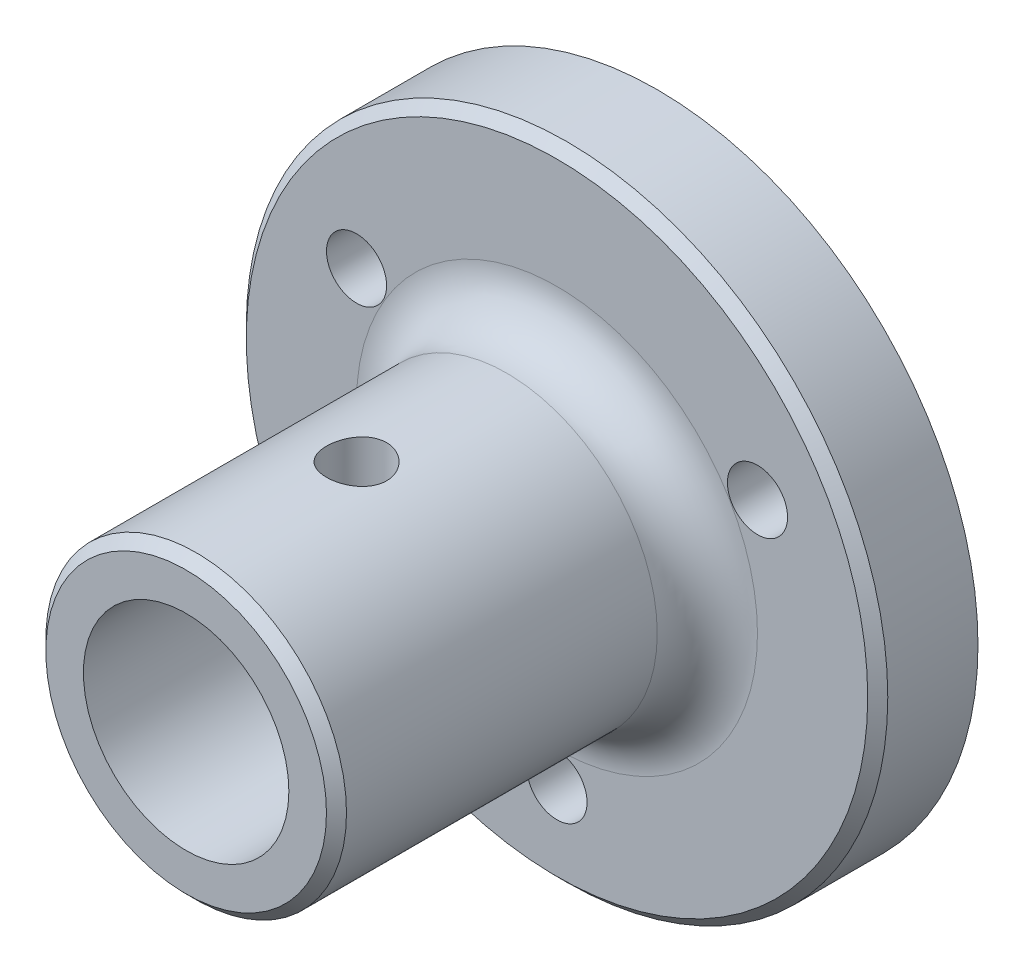
ISO-10303-21;
HEADER;
FILE_DESCRIPTION(('STEP AP214'),'2;1');
FILE_NAME('part.step','',(''),(''),'','','');
FILE_SCHEMA(('AUTOMOTIVE_DESIGN { 1 0 10303 214 1 1 1 1 }'));
ENDSEC;
DATA;
#1=APPLICATION_CONTEXT('core data for automotive mechanical design processes');
#2=APPLICATION_PROTOCOL_DEFINITION('international standard','automotive_design',2000,#1);
#3=PRODUCT_CONTEXT('',#1,'mechanical');
#4=PRODUCT('Part','Part','',(#3));
#5=PRODUCT_RELATED_PRODUCT_CATEGORY('part','',(#4));
#6=PRODUCT_DEFINITION_FORMATION('','',#4);
#7=PRODUCT_DEFINITION_CONTEXT('part definition',#1,'design');
#8=PRODUCT_DEFINITION('design','',#6,#7);
#9=PRODUCT_DEFINITION_SHAPE('','',#8);
#10=(LENGTH_UNIT() NAMED_UNIT(*) SI_UNIT(.MILLI.,.METRE.));
#11=(NAMED_UNIT(*) PLANE_ANGLE_UNIT() SI_UNIT($,.RADIAN.));
#12=(NAMED_UNIT(*) SI_UNIT($,.STERADIAN.) SOLID_ANGLE_UNIT());
#13=UNCERTAINTY_MEASURE_WITH_UNIT(LENGTH_MEASURE(1.E-05),#10,'distance_accuracy_value','');
#14=(GEOMETRIC_REPRESENTATION_CONTEXT(3) GLOBAL_UNCERTAINTY_ASSIGNED_CONTEXT((#13)) GLOBAL_UNIT_ASSIGNED_CONTEXT((#10,
#11,#12)) REPRESENTATION_CONTEXT('',''));
#15=CARTESIAN_POINT('',(0.,0.,0.));
#16=DIRECTION('',(0.,0.,1.));
#17=DIRECTION('',(1.,0.,0.));
#18=AXIS2_PLACEMENT_3D('',#15,#16,#17);
#19=CARTESIAN_POINT('',(0.,0.,10.));
#20=DIRECTION('',(0.,0.,1.));
#21=DIRECTION('',(1.,0.,0.));
#22=AXIS2_PLACEMENT_3D('',#19,#20,#21);
#23=PLANE('',#22);
#24=CARTESIAN_POINT('',(0.,0.,10.));
#25=DIRECTION('',(0.,0.,1.));
#26=DIRECTION('',(1.,0.,0.));
#27=AXIS2_PLACEMENT_3D('',#24,#25,#26);
#28=CIRCLE('',#27,31.);
#29=CARTESIAN_POINT('',(31.,0.,10.));
#30=VERTEX_POINT('',#29);
#31=EDGE_CURVE('E48',#30,#30,#28,.T.);
#32=ORIENTED_EDGE('',*,*,#31,.T.);
#33=EDGE_LOOP('',(#32));
#34=FACE_BOUND('',#33,.T.);
#35=CARTESIAN_POINT('',(0.,0.,10.));
#36=DIRECTION('',(0.,0.,1.));
#37=DIRECTION('',(1.,0.,0.));
#38=AXIS2_PLACEMENT_3D('',#35,#36,#37);
#39=CIRCLE('',#38,20.);
#40=CARTESIAN_POINT('',(20.,0.,10.));
#41=VERTEX_POINT('',#40);
#42=EDGE_CURVE('E64',#41,#41,#39,.F.);
#43=ORIENTED_EDGE('',*,*,#42,.T.);
#44=EDGE_LOOP('',(#43));
#45=FACE_BOUND('',#44,.T.);
#46=CARTESIAN_POINT('',(0.,-23.094010767585,10.));
#47=DIRECTION('',(0.,0.,1.));
#48=DIRECTION('',(1.,0.,0.));
#49=AXIS2_PLACEMENT_3D('',#46,#47,#48);
#50=CIRCLE('',#49,3.);
#51=CARTESIAN_POINT('',(3.,-23.094010767585,10.));
#52=VERTEX_POINT('',#51);
#53=EDGE_CURVE('E177',#52,#52,#50,.T.);
#54=ORIENTED_EDGE('',*,*,#53,.F.);
#55=EDGE_LOOP('',(#54));
#56=FACE_BOUND('',#55,.T.);
#57=CARTESIAN_POINT('',(20.,11.5470053837925,10.));
#58=DIRECTION('',(0.,0.,1.));
#59=DIRECTION('',(1.,0.,0.));
#60=AXIS2_PLACEMENT_3D('',#57,#58,#59);
#61=CIRCLE('',#60,3.);
#62=CARTESIAN_POINT('',(23.,11.5470053837925,10.));
#63=VERTEX_POINT('',#62);
#64=EDGE_CURVE('E185',#63,#63,#61,.T.);
#65=ORIENTED_EDGE('',*,*,#64,.F.);
#66=EDGE_LOOP('',(#65));
#67=FACE_BOUND('',#66,.T.);
#68=CARTESIAN_POINT('',(-20.,11.5470053837925,10.));
#69=DIRECTION('',(0.,0.,1.));
#70=DIRECTION('',(1.,0.,0.));
#71=AXIS2_PLACEMENT_3D('',#68,#69,#70);
#72=CIRCLE('',#71,3.);
#73=CARTESIAN_POINT('',(-17.,11.5470053837925,10.));
#74=VERTEX_POINT('',#73);
#75=EDGE_CURVE('E169',#74,#74,#72,.T.);
#76=ORIENTED_EDGE('',*,*,#75,.F.);
#77=EDGE_LOOP('',(#76));
#78=FACE_BOUND('',#77,.T.);
#79=ADVANCED_FACE('F39',(#34,#45,#56,#67,#78),#23,.T.);
#80=CARTESIAN_POINT('',(0.,0.,0.));
#81=DIRECTION('',(0.,0.,1.));
#82=DIRECTION('',(1.,0.,0.));
#83=AXIS2_PLACEMENT_3D('',#80,#81,#82);
#84=PLANE('',#83);
#85=CARTESIAN_POINT('',(0.,0.,0.));
#86=DIRECTION('',(0.,0.,1.));
#87=DIRECTION('',(1.,0.,0.));
#88=AXIS2_PLACEMENT_3D('',#85,#86,#87);
#89=CIRCLE('',#88,32.);
#90=CARTESIAN_POINT('',(32.,0.,0.));
#91=VERTEX_POINT('',#90);
#92=EDGE_CURVE('E189',#91,#91,#89,.T.);
#93=ORIENTED_EDGE('',*,*,#92,.F.);
#94=EDGE_LOOP('',(#93));
#95=FACE_BOUND('',#94,.T.);
#96=CARTESIAN_POINT('',(20.,11.5470053837925,0.));
#97=DIRECTION('',(0.,0.,1.));
#98=DIRECTION('',(1.,0.,0.));
#99=AXIS2_PLACEMENT_3D('',#96,#97,#98);
#100=CIRCLE('',#99,3.);
#101=CARTESIAN_POINT('',(23.,11.5470053837925,0.));
#102=VERTEX_POINT('',#101);
#103=EDGE_CURVE('E181',#102,#102,#100,.T.);
#104=ORIENTED_EDGE('',*,*,#103,.T.);
#105=EDGE_LOOP('',(#104));
#106=FACE_BOUND('',#105,.T.);
#107=CARTESIAN_POINT('',(0.,-23.094010767585,0.));
#108=DIRECTION('',(0.,0.,1.));
#109=DIRECTION('',(1.,0.,0.));
#110=AXIS2_PLACEMENT_3D('',#107,#108,#109);
#111=CIRCLE('',#110,3.);
#112=CARTESIAN_POINT('',(3.,-23.094010767585,0.));
#113=VERTEX_POINT('',#112);
#114=EDGE_CURVE('E175',#113,#113,#111,.T.);
#115=ORIENTED_EDGE('',*,*,#114,.T.);
#116=EDGE_LOOP('',(#115));
#117=FACE_BOUND('',#116,.T.);
#118=CARTESIAN_POINT('',(-20.,11.5470053837925,0.));
#119=DIRECTION('',(0.,0.,1.));
#120=DIRECTION('',(1.,0.,0.));
#121=AXIS2_PLACEMENT_3D('',#118,#119,#120);
#122=CIRCLE('',#121,3.);
#123=CARTESIAN_POINT('',(-17.,11.5470053837925,0.));
#124=VERTEX_POINT('',#123);
#125=EDGE_CURVE('E165',#124,#124,#122,.T.);
#126=ORIENTED_EDGE('',*,*,#125,.T.);
#127=EDGE_LOOP('',(#126));
#128=FACE_BOUND('',#127,.T.);
#129=ADVANCED_FACE('F135',(#95,#106,#117,#128),#84,.F.);
#130=CARTESIAN_POINT('',(0.,0.,10.));
#131=DIRECTION('',(0.,0.,-1.));
#132=DIRECTION('',(-1.,0.,0.));
#133=AXIS2_PLACEMENT_3D('',#130,#131,#132);
#134=CYLINDRICAL_SURFACE('',#133,32.);
#135=CARTESIAN_POINT('',(0.,0.,9.00000000000001));
#136=DIRECTION('',(0.,0.,1.));
#137=DIRECTION('',(1.,0.,0.));
#138=AXIS2_PLACEMENT_3D('',#135,#136,#137);
#139=CIRCLE('',#138,32.);
#140=CARTESIAN_POINT('',(32.,0.,9.00000000000001));
#141=VERTEX_POINT('',#140);
#142=EDGE_CURVE('E10',#141,#141,#139,.F.);
#143=ORIENTED_EDGE('',*,*,#142,.T.);
#144=EDGE_LOOP('',(#143));
#145=FACE_BOUND('',#144,.T.);
#146=ORIENTED_EDGE('',*,*,#92,.T.);
#147=EDGE_LOOP('',(#146));
#148=FACE_BOUND('',#147,.T.);
#149=ADVANCED_FACE('F131',(#145,#148),#134,.T.);
#150=CARTESIAN_POINT('',(20.,11.5470053837925,10.));
#151=DIRECTION('',(0.,0.,-1.));
#152=DIRECTION('',(-1.,0.,0.));
#153=AXIS2_PLACEMENT_3D('',#150,#151,#152);
#154=CYLINDRICAL_SURFACE('',#153,3.);
#155=ORIENTED_EDGE('',*,*,#64,.T.);
#156=EDGE_LOOP('',(#155));
#157=FACE_BOUND('',#156,.T.);
#158=ORIENTED_EDGE('',*,*,#103,.F.);
#159=EDGE_LOOP('',(#158));
#160=FACE_BOUND('',#159,.T.);
#161=ADVANCED_FACE('F127',(#157,#160),#154,.F.);
#162=CARTESIAN_POINT('',(0.,-23.094010767585,10.));
#163=DIRECTION('',(0.,0.,-1.));
#164=DIRECTION('',(-1.,0.,0.));
#165=AXIS2_PLACEMENT_3D('',#162,#163,#164);
#166=CYLINDRICAL_SURFACE('',#165,3.);
#167=ORIENTED_EDGE('',*,*,#53,.T.);
#168=EDGE_LOOP('',(#167));
#169=FACE_BOUND('',#168,.T.);
#170=ORIENTED_EDGE('',*,*,#114,.F.);
#171=EDGE_LOOP('',(#170));
#172=FACE_BOUND('',#171,.T.);
#173=ADVANCED_FACE('F123',(#169,#172),#166,.F.);
#174=CARTESIAN_POINT('',(-20.,11.5470053837925,10.));
#175=DIRECTION('',(0.,0.,-1.));
#176=DIRECTION('',(-1.,0.,0.));
#177=AXIS2_PLACEMENT_3D('',#174,#175,#176);
#178=CYLINDRICAL_SURFACE('',#177,3.);
#179=ORIENTED_EDGE('',*,*,#75,.T.);
#180=EDGE_LOOP('',(#179));
#181=FACE_BOUND('',#180,.T.);
#182=ORIENTED_EDGE('',*,*,#125,.F.);
#183=EDGE_LOOP('',(#182));
#184=FACE_BOUND('',#183,.T.);
#185=ADVANCED_FACE('F119',(#181,#184),#178,.F.);
#186=CARTESIAN_POINT('',(0.,0.,47.));
#187=DIRECTION('',(0.,0.,1.));
#188=DIRECTION('',(1.,0.,0.));
#189=AXIS2_PLACEMENT_3D('',#186,#187,#188);
#190=PLANE('',#189);
#191=CARTESIAN_POINT('',(0.,0.,47.));
#192=DIRECTION('',(0.,0.,1.));
#193=DIRECTION('',(1.,0.,0.));
#194=AXIS2_PLACEMENT_3D('',#191,#192,#193);
#195=CIRCLE('',#194,14.);
#196=CARTESIAN_POINT('',(14.,0.,47.));
#197=VERTEX_POINT('',#196);
#198=EDGE_CURVE('E58',#197,#197,#195,.T.);
#199=ORIENTED_EDGE('',*,*,#198,.T.);
#200=EDGE_LOOP('',(#199));
#201=FACE_BOUND('',#200,.T.);
#202=CARTESIAN_POINT('',(0.,0.,47.));
#203=DIRECTION('',(0.,0.,1.));
#204=DIRECTION('',(1.,0.,0.));
#205=AXIS2_PLACEMENT_3D('',#202,#203,#204);
#206=CIRCLE('',#205,10.25);
#207=CARTESIAN_POINT('',(10.25,0.,47.));
#208=VERTEX_POINT('',#207);
#209=EDGE_CURVE('E162',#208,#208,#206,.T.);
#210=ORIENTED_EDGE('',*,*,#209,.F.);
#211=EDGE_LOOP('',(#210));
#212=FACE_BOUND('',#211,.T.);
#213=ADVANCED_FACE('F117',(#201,#212),#190,.T.);
#214=CARTESIAN_POINT('',(0.,0.,47.));
#215=DIRECTION('',(0.,0.,-1.));
#216=DIRECTION('',(-1.,0.,0.));
#217=AXIS2_PLACEMENT_3D('',#214,#215,#216);
#218=CYLINDRICAL_SURFACE('',#217,15.);
#219=CARTESIAN_POINT('',(0.,0.,46.));
#220=DIRECTION('',(0.,0.,1.));
#221=DIRECTION('',(1.,0.,0.));
#222=AXIS2_PLACEMENT_3D('',#219,#220,#221);
#223=CIRCLE('',#222,15.);
#224=CARTESIAN_POINT('',(15.,0.,46.));
#225=VERTEX_POINT('',#224);
#226=EDGE_CURVE('E53',#225,#225,#223,.F.);
#227=ORIENTED_EDGE('',*,*,#226,.T.);
#228=EDGE_LOOP('',(#227));
#229=FACE_BOUND('',#228,.T.);
#230=CARTESIAN_POINT('',(0.,0.,15.));
#231=DIRECTION('',(0.,0.,1.));
#232=DIRECTION('',(1.,0.,0.));
#233=AXIS2_PLACEMENT_3D('',#230,#231,#232);
#234=CIRCLE('',#233,15.);
#235=CARTESIAN_POINT('',(15.,0.,15.));
#236=VERTEX_POINT('',#235);
#237=EDGE_CURVE('E68',#236,#236,#234,.T.);
#238=ORIENTED_EDGE('',*,*,#237,.T.);
#239=EDGE_LOOP('',(#238));
#240=FACE_BOUND('',#239,.T.);
#241=CARTESIAN_POINT('',(0.,-15.,33.));
#242=CARTESIAN_POINT('',(0.166730720377901,-14.9999969274261,32.999993866505));
#243=CARTESIAN_POINT('',(0.333538980604569,-14.9971915553469,32.9860534710971));
#244=CARTESIAN_POINT('',(0.66244052306706,-14.9862709686969,32.9307044996543));
#245=CARTESIAN_POINT('',(0.824529952624069,-14.9781515358056,32.8892741015955));
#246=CARTESIAN_POINT('',(1.13919091578994,-14.9575094783486,32.7802761791376));
#247=CARTESIAN_POINT('',(1.2917714037994,-14.9449910723015,32.7127336894659));
#248=CARTESIAN_POINT('',(1.58342396659268,-14.9169119410594,32.5535032574661));
#249=CARTESIAN_POINT('',(1.72249684522744,-14.9013513970712,32.4618167531784));
#250=CARTESIAN_POINT('',(1.98508043194459,-14.8686649598991,32.2555845171257));
#251=CARTESIAN_POINT('',(2.10838185347557,-14.8515223651304,32.1407749338264));
#252=CARTESIAN_POINT('',(2.33411026982409,-14.8177254135776,31.8921227508249));
#253=CARTESIAN_POINT('',(2.43653563431128,-14.8010710950127,31.7582786659946));
#254=CARTESIAN_POINT('',(2.61849526004286,-14.7699732543785,31.4738514209644));
#255=CARTESIAN_POINT('',(2.6978128165976,-14.7555512209484,31.3231270686109));
#256=CARTESIAN_POINT('',(2.82991699974093,-14.7307880417525,31.0101545429878));
#257=CARTESIAN_POINT('',(2.88270624731171,-14.7204464928589,30.847907509961));
#258=CARTESIAN_POINT('',(2.95957589965448,-14.7051841575661,30.5187469082762));
#259=CARTESIAN_POINT('',(2.98402349387633,-14.7001941032156,30.3519223675733));
#260=CARTESIAN_POINT('',(3.00465638317836,-14.6959912518188,30.016470535907));
#261=CARTESIAN_POINT('',(3.0008445681405,-14.6967778640352,29.8478434310396));
#262=CARTESIAN_POINT('',(2.96536371930546,-14.7039765344455,29.516259635937));
#263=CARTESIAN_POINT('',(2.93411562073172,-14.7103035857629,29.3532557831181));
#264=CARTESIAN_POINT('',(2.84531365386915,-14.7277363848,29.034851770011));
#265=CARTESIAN_POINT('',(2.78775852930205,-14.7388423607334,28.879451973243));
#266=CARTESIAN_POINT('',(2.64757435102416,-14.7646685550122,28.5794542148892));
#267=CARTESIAN_POINT('',(2.56477845369635,-14.7794126944111,28.4349363612925));
#268=CARTESIAN_POINT('',(2.37658072371804,-14.8108385631919,28.1616874500816));
#269=CARTESIAN_POINT('',(2.27117629307049,-14.827520515151,28.0329582094465));
#270=CARTESIAN_POINT('',(2.03849980368175,-14.8613106372439,27.7925117926292));
#271=CARTESIAN_POINT('',(1.91086848363734,-14.8784210763271,27.6811422964226));
#272=CARTESIAN_POINT('',(1.63855507218603,-14.9108654614323,27.4813384610963));
#273=CARTESIAN_POINT('',(1.49387276213817,-14.9261993846692,27.3929044161193));
#274=CARTESIAN_POINT('',(1.19117816063676,-14.9534007048266,27.2414174723221));
#275=CARTESIAN_POINT('',(1.0331454587559,-14.9652626654482,27.1784043190664));
#276=CARTESIAN_POINT('',(0.708446929345996,-14.9841422696357,27.0799185778843));
#277=CARTESIAN_POINT('',(0.541782150217351,-14.9911605000159,27.0444426537791));
#278=CARTESIAN_POINT('',(0.207538216881454,-14.999480156006,27.0025306386172));
#279=CARTESIAN_POINT('',(0.0400209849767314,-15.0008752395741,26.9956187413792));
#280=CARTESIAN_POINT('',(-0.293774802578139,-14.9980515579031,27.0097495768265));
#281=CARTESIAN_POINT('',(-0.460053427331377,-14.9938331082434,27.0307907380578));
#282=CARTESIAN_POINT('',(-0.785116979839619,-14.9803149602405,27.0998351206319));
#283=CARTESIAN_POINT('',(-0.943955845019705,-14.9710612921262,27.1475942054937));
#284=CARTESIAN_POINT('',(-1.251370882499,-14.948506561831,27.2684519479674));
#285=CARTESIAN_POINT('',(-1.39994628491262,-14.9352051964268,27.3415525040305));
#286=CARTESIAN_POINT('',(-1.68462352105865,-14.9057973459988,27.5120474719539));
#287=CARTESIAN_POINT('',(-1.82055038025656,-14.8896585131116,27.6097283431168));
#288=CARTESIAN_POINT('',(-2.07425405735762,-14.8564420448965,27.8262275736218));
#289=CARTESIAN_POINT('',(-2.19202892679229,-14.8393643090516,27.9450481991996));
#290=CARTESIAN_POINT('',(-2.40792177232253,-14.8058791067089,28.2026200556734));
#291=CARTESIAN_POINT('',(-2.50571310734596,-14.7894858069991,28.341647232664));
#292=CARTESIAN_POINT('',(-2.67655626015362,-14.7595257538858,28.63443408407));
#293=CARTESIAN_POINT('',(-2.74960906776871,-14.7459588874003,28.7881931687207));
#294=CARTESIAN_POINT('',(-2.86845552474588,-14.7233022175315,29.1053047384486));
#295=CARTESIAN_POINT('',(-2.91439049937315,-14.7141892461656,29.268602523631));
#296=CARTESIAN_POINT('',(-2.97812595488159,-14.7014231037608,29.6008003604727));
#297=CARTESIAN_POINT('',(-2.99593010467534,-14.6977692207333,29.769699678628));
#298=CARTESIAN_POINT('',(-3.0027627326024,-14.6963744889414,30.105026593633));
#299=CARTESIAN_POINT('',(-2.99230736421269,-14.698527575679,30.271443446781));
#300=CARTESIAN_POINT('',(-2.94405691230018,-14.7082672045384,30.6000949497151));
#301=CARTESIAN_POINT('',(-2.90626204838789,-14.7158537030151,30.7623296330844));
#302=CARTESIAN_POINT('',(-2.80463570549686,-14.7355579265748,31.0776831337216));
#303=CARTESIAN_POINT('',(-2.74086752015203,-14.7476646305649,31.2308230815072));
#304=CARTESIAN_POINT('',(-2.58916393380481,-14.7750514492251,31.5243111622033));
#305=CARTESIAN_POINT('',(-2.50122650632465,-14.7903318299668,31.6646582211754));
#306=CARTESIAN_POINT('',(-2.30191774435924,-14.8226688156968,31.9311467164509));
#307=CARTESIAN_POINT('',(-2.19017366170554,-14.839751187291,32.0570062958028));
#308=CARTESIAN_POINT('',(-1.94719310703942,-14.8735824561586,32.2883586165875));
#309=CARTESIAN_POINT('',(-1.81595216146,-14.8903312758955,32.3938466709518));
#310=CARTESIAN_POINT('',(-1.53605288726474,-14.9218149716391,32.5825039318393));
#311=CARTESIAN_POINT('',(-1.3872266532895,-14.9365269365774,32.6654280098401));
#312=CARTESIAN_POINT('',(-1.0774990828222,-14.96205375255,32.8049583677898));
#313=CARTESIAN_POINT('',(-0.916608782589378,-14.9728721141585,32.8615883685975));
#314=CARTESIAN_POINT('',(-0.629464466771338,-14.9872911778611,32.9359558441341));
#315=CARTESIAN_POINT('',(-0.504844992041353,-14.9920290947535,32.9599295811233));
#316=CARTESIAN_POINT('',(-0.253498575630199,-14.9983846241968,32.9919537370751));
#317=CARTESIAN_POINT('',(-0.126771701245855,-15.0000023361946,33.0000046635293));
#318=CARTESIAN_POINT('',(0.,-15.,33.));
#319=B_SPLINE_CURVE_WITH_KNOTS('',3,(#241,#242,#243,#244,#245,#246,#247,#248,#249,#250,#251,
#252,#253,#254,#255,#256,#257,#258,#259,#260,#261,#262,#263,#264,#265,#266,#267,#268,#269,#270,
#271,#272,#273,#274,#275,#276,#277,#278,#279,#280,#281,#282,#283,#284,#285,#286,#287,#288,#289,
#290,#291,#292,#293,#294,#295,#296,#297,#298,#299,#300,#301,#302,#303,#304,#305,#306,#307,#308,
#309,#310,#311,#312,#313,#314,#315,#316,#317,#318),.UNSPECIFIED.,.T.,.F.,(4,2,2,2,2,2,2,2,2,2,2,
2,2,2,2,2,2,2,2,2,2,2,2,2,2,2,2,2,2,2,2,2,2,2,2,2,2,2,4),(0.,0.499728391983775,
0.999853952073969,1.49950120575102,1.99911870669259,2.50479801033655,3.0105167902421,
3.52083585017768,4.03110448095592,4.53468555310762,5.03821512843675,5.53415181018835,
6.03011217761189,6.52942470610778,7.02879464249012,7.53714757474052,8.04550702619461,
8.55465824562072,9.06374777094108,9.56432207028796,10.064868229736,10.5609136185217,
11.0569961764807,11.5591519810008,12.0613616503779,12.5712188573768,13.081055661704,
13.5882114309817,14.0953010499124,14.593191677031,15.0910783047783,15.5877588375933,
16.084481027456,16.5896422871743,17.0949196359879,17.6054849002691,18.1155886655256,
18.4955632586968,18.8755257411299),.UNSPECIFIED.);
#320=CARTESIAN_POINT('',(0.,-15.,33.));
#321=VERTEX_POINT('',#320);
#322=EDGE_CURVE('E108',#321,#321,#319,.T.);
#323=ORIENTED_EDGE('',*,*,#322,.T.);
#324=EDGE_LOOP('',(#323));
#325=FACE_BOUND('',#324,.T.);
#326=CARTESIAN_POINT('',(0.,15.,33.));
#327=CARTESIAN_POINT('',(-0.166730720377898,14.9999969274261,32.999993866505));
#328=CARTESIAN_POINT('',(-0.333538980604565,14.9971915553469,32.9860534710971));
#329=CARTESIAN_POINT('',(-0.662440523067056,14.9862709686969,32.9307044996543));
#330=CARTESIAN_POINT('',(-0.824529952624065,14.9781515358056,32.8892741015955));
#331=CARTESIAN_POINT('',(-1.13919091578994,14.9575094783486,32.7802761791376));
#332=CARTESIAN_POINT('',(-1.2917714037994,14.9449910723015,32.7127336894659));
#333=CARTESIAN_POINT('',(-1.58342396659267,14.9169119410594,32.5535032574661));
#334=CARTESIAN_POINT('',(-1.72249684522743,14.9013513970712,32.4618167531784));
#335=CARTESIAN_POINT('',(-1.98508043194459,14.8686649598991,32.2555845171257));
#336=CARTESIAN_POINT('',(-2.10838185347557,14.8515223651304,32.1407749338264));
#337=CARTESIAN_POINT('',(-2.33411026982408,14.8177254135776,31.8921227508249));
#338=CARTESIAN_POINT('',(-2.43653563431127,14.8010710950127,31.7582786659946));
#339=CARTESIAN_POINT('',(-2.61849526004286,14.7699732543785,31.4738514209644));
#340=CARTESIAN_POINT('',(-2.6978128165976,14.7555512209484,31.3231270686109));
#341=CARTESIAN_POINT('',(-2.82991699974092,14.7307880417525,31.0101545429878));
#342=CARTESIAN_POINT('',(-2.88270624731171,14.7204464928588,30.847907509961));
#343=CARTESIAN_POINT('',(-2.95957589965448,14.7051841575661,30.5187469082762));
#344=CARTESIAN_POINT('',(-2.98402349387633,14.7001941032156,30.3519223675733));
#345=CARTESIAN_POINT('',(-3.00465638317836,14.6959912518188,30.016470535907));
#346=CARTESIAN_POINT('',(-3.0008445681405,14.6967778640352,29.8478434310396));
#347=CARTESIAN_POINT('',(-2.96536371930546,14.7039765344455,29.516259635937));
#348=CARTESIAN_POINT('',(-2.93411562073172,14.7103035857629,29.3532557831181));
#349=CARTESIAN_POINT('',(-2.84531365386915,14.7277363848,29.034851770011));
#350=CARTESIAN_POINT('',(-2.78775852930204,14.7388423607334,28.879451973243));
#351=CARTESIAN_POINT('',(-2.64757435102416,14.7646685550122,28.5794542148892));
#352=CARTESIAN_POINT('',(-2.56477845369634,14.7794126944111,28.4349363612925));
#353=CARTESIAN_POINT('',(-2.37658072371804,14.8108385631919,28.1616874500816));
#354=CARTESIAN_POINT('',(-2.27117629307049,14.827520515151,28.0329582094465));
#355=CARTESIAN_POINT('',(-2.03849980368175,14.8613106372439,27.7925117926292));
#356=CARTESIAN_POINT('',(-1.91086848363733,14.8784210763271,27.6811422964226));
#357=CARTESIAN_POINT('',(-1.63855507218603,14.9108654614323,27.4813384610963));
#358=CARTESIAN_POINT('',(-1.49387276213817,14.9261993846692,27.3929044161193));
#359=CARTESIAN_POINT('',(-1.19117816063676,14.9534007048266,27.2414174723221));
#360=CARTESIAN_POINT('',(-1.0331454587559,14.9652626654482,27.1784043190664));
#361=CARTESIAN_POINT('',(-0.708446929345993,14.9841422696357,27.0799185778843));
#362=CARTESIAN_POINT('',(-0.541782150217348,14.9911605000159,27.0444426537791));
#363=CARTESIAN_POINT('',(-0.207538216881451,14.999480156006,27.0025306386172));
#364=CARTESIAN_POINT('',(-0.0400209849767283,15.0008752395741,26.9956187413792));
#365=CARTESIAN_POINT('',(0.293774802578143,14.9980515579031,27.0097495768265));
#366=CARTESIAN_POINT('',(0.46005342733138,14.9938331082434,27.0307907380578));
#367=CARTESIAN_POINT('',(0.785116979839623,14.9803149602405,27.0998351206319));
#368=CARTESIAN_POINT('',(0.943955845019709,14.9710612921262,27.1475942054937));
#369=CARTESIAN_POINT('',(1.251370882499,14.948506561831,27.2684519479674));
#370=CARTESIAN_POINT('',(1.39994628491262,14.9352051964268,27.3415525040305));
#371=CARTESIAN_POINT('',(1.68462352105865,14.9057973459988,27.5120474719539));
#372=CARTESIAN_POINT('',(1.82055038025656,14.8896585131116,27.6097283431168));
#373=CARTESIAN_POINT('',(2.07425405735762,14.8564420448965,27.8262275736218));
#374=CARTESIAN_POINT('',(2.19202892679229,14.8393643090516,27.9450481991996));
#375=CARTESIAN_POINT('',(2.40792177232253,14.8058791067089,28.2026200556734));
#376=CARTESIAN_POINT('',(2.50571310734597,14.7894858069991,28.341647232664));
#377=CARTESIAN_POINT('',(2.67655626015362,14.7595257538858,28.63443408407));
#378=CARTESIAN_POINT('',(2.74960906776871,14.7459588874003,28.7881931687207));
#379=CARTESIAN_POINT('',(2.86845552474588,14.7233022175315,29.1053047384486));
#380=CARTESIAN_POINT('',(2.91439049937315,14.7141892461656,29.268602523631));
#381=CARTESIAN_POINT('',(2.97812595488159,14.7014231037608,29.6008003604727));
#382=CARTESIAN_POINT('',(2.99593010467534,14.6977692207333,29.769699678628));
#383=CARTESIAN_POINT('',(3.00276273260241,14.6963744889414,30.105026593633));
#384=CARTESIAN_POINT('',(2.99230736421269,14.698527575679,30.271443446781));
#385=CARTESIAN_POINT('',(2.94405691230018,14.7082672045384,30.6000949497151));
#386=CARTESIAN_POINT('',(2.9062620483879,14.7158537030151,30.7623296330844));
#387=CARTESIAN_POINT('',(2.80463570549687,14.7355579265748,31.0776831337216));
#388=CARTESIAN_POINT('',(2.74086752015204,14.7476646305649,31.2308230815072));
#389=CARTESIAN_POINT('',(2.58916393380482,14.7750514492251,31.5243111622033));
#390=CARTESIAN_POINT('',(2.50122650632465,14.7903318299668,31.6646582211754));
#391=CARTESIAN_POINT('',(2.30191774435925,14.8226688156968,31.9311467164509));
#392=CARTESIAN_POINT('',(2.19017366170555,14.839751187291,32.0570062958028));
#393=CARTESIAN_POINT('',(1.94719310703943,14.8735824561586,32.2883586165875));
#394=CARTESIAN_POINT('',(1.81595216146001,14.8903312758955,32.3938466709518));
#395=CARTESIAN_POINT('',(1.53605288726474,14.9218149716391,32.5825039318393));
#396=CARTESIAN_POINT('',(1.3872266532895,14.9365269365774,32.6654280098401));
#397=CARTESIAN_POINT('',(1.0774990828222,14.96205375255,32.8049583677898));
#398=CARTESIAN_POINT('',(0.91660878258938,14.9728721141585,32.8615883685975));
#399=CARTESIAN_POINT('',(0.629464466771343,14.9872911778611,32.9359558441341));
#400=CARTESIAN_POINT('',(0.504844992041359,14.9920290947536,32.9599295811233));
#401=CARTESIAN_POINT('',(0.253498575630206,14.9983846241968,32.9919537370751));
#402=CARTESIAN_POINT('',(0.12677170124586,15.0000023361946,33.0000046635293));
#403=CARTESIAN_POINT('',(0.,15.,33.));
#404=B_SPLINE_CURVE_WITH_KNOTS('',3,(#326,#327,#328,#329,#330,#331,#332,#333,#334,#335,#336,
#337,#338,#339,#340,#341,#342,#343,#344,#345,#346,#347,#348,#349,#350,#351,#352,#353,#354,#355,
#356,#357,#358,#359,#360,#361,#362,#363,#364,#365,#366,#367,#368,#369,#370,#371,#372,#373,#374,
#375,#376,#377,#378,#379,#380,#381,#382,#383,#384,#385,#386,#387,#388,#389,#390,#391,#392,#393,
#394,#395,#396,#397,#398,#399,#400,#401,#402,#403),.UNSPECIFIED.,.T.,.F.,(4,2,2,2,2,2,2,2,2,2,2,
2,2,2,2,2,2,2,2,2,2,2,2,2,2,2,2,2,2,2,2,2,2,2,2,2,2,2,4),(0.,0.499728391983775,
0.999853952073969,1.49950120575102,1.99911870669259,2.50479801033656,3.0105167902421,
3.52083585017768,4.03110448095592,4.53468555310762,5.03821512843675,5.53415181018835,
6.03011217761189,6.52942470610778,7.02879464249012,7.53714757474052,8.04550702619461,
8.55465824562072,9.06374777094108,9.56432207028796,10.064868229736,10.5609136185217,
11.0569961764807,11.5591519810008,12.0613616503779,12.5712188573768,13.081055661704,
13.5882114309817,14.0953010499124,14.593191677031,15.0910783047783,15.5877588375933,
16.084481027456,16.5896422871743,17.0949196359879,17.6054849002691,18.1155886655256,
18.4955632586968,18.8755257411299),.UNSPECIFIED.);
#405=CARTESIAN_POINT('',(0.,15.,33.));
#406=VERTEX_POINT('',#405);
#407=EDGE_CURVE('E82',#406,#406,#404,.T.);
#408=ORIENTED_EDGE('',*,*,#407,.T.);
#409=EDGE_LOOP('',(#408));
#410=FACE_BOUND('',#409,.T.);
#411=ADVANCED_FACE('F113',(#229,#240,#325,#410),#218,.T.);
#412=CARTESIAN_POINT('',(0.,0.,47.));
#413=DIRECTION('',(0.,0.,-1.));
#414=DIRECTION('',(-1.,0.,0.));
#415=AXIS2_PLACEMENT_3D('',#412,#413,#414);
#416=CYLINDRICAL_SURFACE('',#415,10.25);
#417=CARTESIAN_POINT('',(0.,-10.25,33.));
#418=CARTESIAN_POINT('',(0.164761030351973,-10.2499982885748,32.9999975190535));
#419=CARTESIAN_POINT('',(0.329547295458406,-10.2459891477057,32.9863817687285));
#420=CARTESIAN_POINT('',(0.654332795535697,-10.230386996352,32.9324001987746));
#421=CARTESIAN_POINT('',(0.814330385454751,-10.2187914102722,32.8920252943628));
#422=CARTESIAN_POINT('',(1.12480632609575,-10.1892890680163,32.7859804168264));
#423=CARTESIAN_POINT('',(1.27529796475204,-10.1713913623467,32.7203467055076));
#424=CARTESIAN_POINT('',(1.56313982492937,-10.1311520971023,32.5657928042986));
#425=CARTESIAN_POINT('',(1.70048848640622,-10.1088100109555,32.4768698546939));
#426=CARTESIAN_POINT('',(1.96191733576444,-10.0613857012864,32.2756873283128));
#427=CARTESIAN_POINT('',(2.08558550559553,-10.0362493869492,32.1629051234802));
#428=CARTESIAN_POINT('',(2.31255048619464,-9.98639778591535,31.9183201581798));
#429=CARTESIAN_POINT('',(2.41584406583257,-9.96168256656547,31.7865143865661));
#430=CARTESIAN_POINT('',(2.60125899002276,-9.91490371417962,31.5041829707671));
#431=CARTESIAN_POINT('',(2.68288409015477,-9.89290754305841,31.3533192064768));
#432=CARTESIAN_POINT('',(2.81943980977289,-9.8548627546537,31.039259257862));
#433=CARTESIAN_POINT('',(2.87437649194788,-9.83881278679458,30.8760658841424));
#434=CARTESIAN_POINT('',(2.95452269393277,-9.81504013380612,30.5465920394521));
#435=CARTESIAN_POINT('',(2.98048902579986,-9.80710592181539,30.380511329967));
#436=CARTESIAN_POINT('',(3.00431990686238,-9.79983320781897,30.0461759626777));
#437=CARTESIAN_POINT('',(3.00219089805734,-9.80049273534856,29.8779218120622));
#438=CARTESIAN_POINT('',(2.97048742281734,-9.81014508286663,29.5501118347946));
#439=CARTESIAN_POINT('',(2.94185346758437,-9.81885231917808,29.3904552598311));
#440=CARTESIAN_POINT('',(2.85946944140989,-9.8431580704573,29.0783189217587));
#441=CARTESIAN_POINT('',(2.80571699957748,-9.85875723593486,28.9258398376167));
#442=CARTESIAN_POINT('',(2.67391255524926,-9.89532234434978,28.630052025485));
#443=CARTESIAN_POINT('',(2.59554994462267,-9.91635624177806,28.4868904643772));
#444=CARTESIAN_POINT('',(2.41696561895684,-9.9613872850994,28.2154303925274));
#445=CARTESIAN_POINT('',(2.31673882796467,-9.98538511853289,28.0871353437789));
#446=CARTESIAN_POINT('',(2.09256856581137,-10.0348053395161,27.8437063685429));
#447=CARTESIAN_POINT('',(1.96784238280467,-10.0602464857032,27.7292958492287));
#448=CARTESIAN_POINT('',(1.70065773106956,-10.1088414191559,27.5228512766226));
#449=CARTESIAN_POINT('',(1.55819825155492,-10.1319950759012,27.4308184997311));
#450=CARTESIAN_POINT('',(1.25832091873287,-10.1736007103458,27.271330925749));
#451=CARTESIAN_POINT('',(1.10081695121619,-10.1920230825114,27.2040298075662));
#452=CARTESIAN_POINT('',(0.776062838465764,-10.2218771397365,27.097082382971));
#453=CARTESIAN_POINT('',(0.608815288482844,-10.2333106770663,27.0574287486769));
#454=CARTESIAN_POINT('',(0.275476791208137,-10.2476087603624,27.0080905027579));
#455=CARTESIAN_POINT('',(0.109542867087531,-10.2507537181414,26.9974247917969));
#456=CARTESIAN_POINT('',(-0.221751346556174,-10.2489391883311,27.003624528379));
#457=CARTESIAN_POINT('',(-0.3871117059723,-10.2439807256534,27.020486494252));
#458=CARTESIAN_POINT('',(-0.708907880964285,-10.2266995731309,27.0804667180821));
#459=CARTESIAN_POINT('',(-0.865458795863897,-10.2145361074543,27.1230176519933));
#460=CARTESIAN_POINT('',(-1.16917031023221,-10.1842453367686,27.2324908383317));
#461=CARTESIAN_POINT('',(-1.31632979951197,-10.1661173282263,27.2994159658577));
#462=CARTESIAN_POINT('',(-1.6007376333411,-10.1252781031291,27.4574236625686));
#463=CARTESIAN_POINT('',(-1.7376904484053,-10.1024733915115,27.5490133691434));
#464=CARTESIAN_POINT('',(-1.99461950577328,-10.0549039781344,27.7531294159292));
#465=CARTESIAN_POINT('',(-2.11459168317153,-10.0301388092763,27.8656607543738));
#466=CARTESIAN_POINT('',(-2.33843282820621,-9.98037315954647,28.113070278167));
#467=CARTESIAN_POINT('',(-2.44160478686513,-9.95539395570076,28.2485846821351));
#468=CARTESIAN_POINT('',(-2.62378498624162,-9.90894158446663,28.5355442932646));
#469=CARTESIAN_POINT('',(-2.70279397633861,-9.88746830835657,28.6869890061748));
#470=CARTESIAN_POINT('',(-2.83384433731139,-9.85070881104072,29.0009476228179));
#471=CARTESIAN_POINT('',(-2.88602104776955,-9.83539162636926,29.1634012022179));
#472=CARTESIAN_POINT('',(-2.9621376686088,-9.81273906354755,29.4953159637075));
#473=CARTESIAN_POINT('',(-2.98608666871315,-9.80540111602868,29.6647748717781));
#474=CARTESIAN_POINT('',(-3.00447077094816,-9.79978244305746,29.9986741615082));
#475=CARTESIAN_POINT('',(-3.00003820655236,-9.80115420912001,30.1630471912933));
#476=CARTESIAN_POINT('',(-2.96447047001477,-9.81196987267041,30.4885940039044));
#477=CARTESIAN_POINT('',(-2.93333627294418,-9.82141347539663,30.6497679033341));
#478=CARTESIAN_POINT('',(-2.8459639231665,-9.84708138643155,30.9625882462732));
#479=CARTESIAN_POINT('',(-2.79001188127977,-9.8632282841048,31.1143214181089));
#480=CARTESIAN_POINT('',(-2.65481394126726,-9.90047257819711,31.4063673303194));
#481=CARTESIAN_POINT('',(-2.57556375480527,-9.92157088584529,31.5466779621459));
#482=CARTESIAN_POINT('',(-2.39278153609463,-9.96725898827188,31.8171853388421));
#483=CARTESIAN_POINT('',(-2.28849929196275,-9.99194486293671,31.9468589490337));
#484=CARTESIAN_POINT('',(-2.05998084382639,-10.0415451100341,32.1872335163894));
#485=CARTESIAN_POINT('',(-1.93573954751622,-10.0664595392459,32.297929616737));
#486=CARTESIAN_POINT('',(-1.66673369726187,-10.11452652781,32.5002165676039));
#487=CARTESIAN_POINT('',(-1.52150065002675,-10.1376122367225,32.5912018710164));
#488=CARTESIAN_POINT('',(-1.21712309212918,-10.1786359424675,32.7473316381438));
#489=CARTESIAN_POINT('',(-1.05798571107092,-10.1965765575289,32.812489251496));
#490=CARTESIAN_POINT('',(-0.750037329507711,-10.2235467251828,32.9086533260251));
#491=CARTESIAN_POINT('',(-0.602277274065562,-10.2333870177589,32.9428186803763));
#492=CARTESIAN_POINT('',(-0.303018218768165,-10.2466139606282,32.9884914677201));
#493=CARTESIAN_POINT('',(-0.151519780227636,-10.2500015738841,33.0000022815618));
#494=CARTESIAN_POINT('',(0.,-10.25,33.));
#495=B_SPLINE_CURVE_WITH_KNOTS('',3,(#417,#418,#419,#420,#421,#422,#423,#424,#425,#426,#427,
#428,#429,#430,#431,#432,#433,#434,#435,#436,#437,#438,#439,#440,#441,#442,#443,#444,#445,#446,
#447,#448,#449,#450,#451,#452,#453,#454,#455,#456,#457,#458,#459,#460,#461,#462,#463,#464,#465,
#466,#467,#468,#469,#470,#471,#472,#473,#474,#475,#476,#477,#478,#479,#480,#481,#482,#483,#484,
#485,#486,#487,#488,#489,#490,#491,#492,#493,#494),.UNSPECIFIED.,.T.,.F.,(4,2,2,2,2,2,2,2,2,2,2,
2,2,2,2,2,2,2,2,2,2,2,2,2,2,2,2,2,2,2,2,2,2,2,2,2,2,2,4),(0.,0.493726734338207,
0.987621175753448,1.48080920633221,1.97405570488177,2.47949748421678,2.98501935534299,
3.50127745347596,4.01741822065636,4.51973447382358,5.02193555256149,5.50697252332598,
5.99205528514922,6.48352459901597,6.97510813326561,7.48618028214054,7.99728157514173,
8.51150712228777,9.02559632365172,9.52205577525038,10.0184524400735,10.5042682205151,
10.9901413247397,11.4868885964294,11.9837545814407,12.4977349514636,13.011699379514,
13.5230453442766,14.0342266033578,14.5251440018394,15.0160434741124,15.5014250662542,
15.9868960553894,16.4892919380903,16.991816205067,17.5080888117488,18.0240982301967,
18.4782137015786,18.9322613979278),.UNSPECIFIED.);
#496=CARTESIAN_POINT('',(0.,-10.25,33.));
#497=VERTEX_POINT('',#496);
#498=EDGE_CURVE('E73',#497,#497,#495,.T.);
#499=ORIENTED_EDGE('',*,*,#498,.F.);
#500=EDGE_LOOP('',(#499));
#501=FACE_BOUND('',#500,.T.);
#502=CARTESIAN_POINT('',(0.,10.25,33.));
#503=CARTESIAN_POINT('',(-0.16476103035197,10.2499982885748,32.9999975190535));
#504=CARTESIAN_POINT('',(-0.329547295458402,10.2459891477057,32.9863817687285));
#505=CARTESIAN_POINT('',(-0.654332795535693,10.230386996352,32.9324001987746));
#506=CARTESIAN_POINT('',(-0.814330385454748,10.2187914102722,32.8920252943628));
#507=CARTESIAN_POINT('',(-1.12480632609575,10.1892890680163,32.7859804168264));
#508=CARTESIAN_POINT('',(-1.27529796475204,10.1713913623467,32.7203467055076));
#509=CARTESIAN_POINT('',(-1.56313982492936,10.1311520971023,32.5657928042986));
#510=CARTESIAN_POINT('',(-1.70048848640622,10.1088100109555,32.4768698546939));
#511=CARTESIAN_POINT('',(-1.96191733576444,10.0613857012864,32.2756873283128));
#512=CARTESIAN_POINT('',(-2.08558550559553,10.0362493869492,32.1629051234802));
#513=CARTESIAN_POINT('',(-2.31255048619464,9.98639778591535,31.9183201581798));
#514=CARTESIAN_POINT('',(-2.41584406583256,9.96168256656548,31.7865143865661));
#515=CARTESIAN_POINT('',(-2.60125899002276,9.91490371417962,31.5041829707671));
#516=CARTESIAN_POINT('',(-2.68288409015477,9.89290754305841,31.3533192064768));
#517=CARTESIAN_POINT('',(-2.81943980977289,9.85486275465371,31.039259257862));
#518=CARTESIAN_POINT('',(-2.87437649194788,9.83881278679458,30.8760658841424));
#519=CARTESIAN_POINT('',(-2.95452269393277,9.81504013380612,30.5465920394521));
#520=CARTESIAN_POINT('',(-2.98048902579986,9.80710592181539,30.380511329967));
#521=CARTESIAN_POINT('',(-3.00431990686238,9.79983320781898,30.0461759626777));
#522=CARTESIAN_POINT('',(-3.00219089805733,9.80049273534856,29.8779218120622));
#523=CARTESIAN_POINT('',(-2.97048742281734,9.81014508286663,29.5501118347946));
#524=CARTESIAN_POINT('',(-2.94185346758437,9.81885231917808,29.3904552598311));
#525=CARTESIAN_POINT('',(-2.85946944140989,9.8431580704573,29.0783189217587));
#526=CARTESIAN_POINT('',(-2.80571699957747,9.85875723593486,28.9258398376167));
#527=CARTESIAN_POINT('',(-2.67391255524925,9.89532234434978,28.630052025485));
#528=CARTESIAN_POINT('',(-2.59554994462267,9.91635624177806,28.4868904643772));
#529=CARTESIAN_POINT('',(-2.41696561895684,9.9613872850994,28.2154303925274));
#530=CARTESIAN_POINT('',(-2.31673882796467,9.98538511853289,28.0871353437789));
#531=CARTESIAN_POINT('',(-2.09256856581136,10.0348053395161,27.8437063685429));
#532=CARTESIAN_POINT('',(-1.96784238280467,10.0602464857032,27.7292958492287));
#533=CARTESIAN_POINT('',(-1.70065773106955,10.1088414191559,27.5228512766226));
#534=CARTESIAN_POINT('',(-1.55819825155491,10.1319950759012,27.4308184997311));
#535=CARTESIAN_POINT('',(-1.25832091873287,10.1736007103458,27.271330925749));
#536=CARTESIAN_POINT('',(-1.10081695121619,10.1920230825114,27.2040298075662));
#537=CARTESIAN_POINT('',(-0.77606283846576,10.2218771397365,27.097082382971));
#538=CARTESIAN_POINT('',(-0.608815288482841,10.2333106770663,27.0574287486769));
#539=CARTESIAN_POINT('',(-0.275476791208134,10.2476087603624,27.0080905027579));
#540=CARTESIAN_POINT('',(-0.109542867087528,10.2507537181414,26.9974247917969));
#541=CARTESIAN_POINT('',(0.221751346556177,10.2489391883311,27.003624528379));
#542=CARTESIAN_POINT('',(0.387111705972304,10.2439807256534,27.020486494252));
#543=CARTESIAN_POINT('',(0.708907880964288,10.2266995731309,27.0804667180821));
#544=CARTESIAN_POINT('',(0.8654587958639,10.2145361074543,27.1230176519933));
#545=CARTESIAN_POINT('',(1.16917031023221,10.1842453367686,27.2324908383317));
#546=CARTESIAN_POINT('',(1.31632979951198,10.1661173282263,27.2994159658577));
#547=CARTESIAN_POINT('',(1.60073763334111,10.1252781031291,27.4574236625686));
#548=CARTESIAN_POINT('',(1.73769044840531,10.1024733915115,27.5490133691434));
#549=CARTESIAN_POINT('',(1.99461950577329,10.0549039781344,27.7531294159292));
#550=CARTESIAN_POINT('',(2.11459168317154,10.0301388092763,27.8656607543738));
#551=CARTESIAN_POINT('',(2.33843282820621,9.98037315954647,28.113070278167));
#552=CARTESIAN_POINT('',(2.44160478686513,9.95539395570076,28.2485846821351));
#553=CARTESIAN_POINT('',(2.62378498624162,9.90894158446663,28.5355442932646));
#554=CARTESIAN_POINT('',(2.70279397633861,9.88746830835656,28.6869890061748));
#555=CARTESIAN_POINT('',(2.83384433731139,9.85070881104072,29.0009476228179));
#556=CARTESIAN_POINT('',(2.88602104776956,9.83539162636926,29.1634012022179));
#557=CARTESIAN_POINT('',(2.9621376686088,9.81273906354755,29.4953159637075));
#558=CARTESIAN_POINT('',(2.98608666871315,9.80540111602868,29.6647748717781));
#559=CARTESIAN_POINT('',(3.00447077094816,9.79978244305745,29.9986741615082));
#560=CARTESIAN_POINT('',(3.00003820655237,9.80115420912001,30.1630471912933));
#561=CARTESIAN_POINT('',(2.96447047001478,9.81196987267041,30.4885940039044));
#562=CARTESIAN_POINT('',(2.93333627294418,9.82141347539663,30.6497679033341));
#563=CARTESIAN_POINT('',(2.84596392316651,9.84708138643155,30.9625882462732));
#564=CARTESIAN_POINT('',(2.79001188127978,9.8632282841048,31.1143214181089));
#565=CARTESIAN_POINT('',(2.65481394126727,9.90047257819711,31.4063673303194));
#566=CARTESIAN_POINT('',(2.57556375480527,9.92157088584529,31.5466779621459));
#567=CARTESIAN_POINT('',(2.39278153609464,9.96725898827188,31.8171853388421));
#568=CARTESIAN_POINT('',(2.28849929196276,9.99194486293671,31.9468589490337));
#569=CARTESIAN_POINT('',(2.05998084382639,10.0415451100341,32.1872335163894));
#570=CARTESIAN_POINT('',(1.93573954751622,10.0664595392459,32.297929616737));
#571=CARTESIAN_POINT('',(1.66673369726187,10.11452652781,32.5002165676039));
#572=CARTESIAN_POINT('',(1.52150065002675,10.1376122367225,32.5912018710164));
#573=CARTESIAN_POINT('',(1.21712309212918,10.1786359424675,32.7473316381438));
#574=CARTESIAN_POINT('',(1.05798571107092,10.1965765575289,32.812489251496));
#575=CARTESIAN_POINT('',(0.750037329507715,10.2235467251828,32.9086533260251));
#576=CARTESIAN_POINT('',(0.602277274065566,10.2333870177589,32.9428186803763));
#577=CARTESIAN_POINT('',(0.303018218768169,10.2466139606282,32.9884914677201));
#578=CARTESIAN_POINT('',(0.151519780227639,10.2500015738841,33.0000022815618));
#579=CARTESIAN_POINT('',(0.,10.25,33.));
#580=B_SPLINE_CURVE_WITH_KNOTS('',3,(#502,#503,#504,#505,#506,#507,#508,#509,#510,#511,#512,
#513,#514,#515,#516,#517,#518,#519,#520,#521,#522,#523,#524,#525,#526,#527,#528,#529,#530,#531,
#532,#533,#534,#535,#536,#537,#538,#539,#540,#541,#542,#543,#544,#545,#546,#547,#548,#549,#550,
#551,#552,#553,#554,#555,#556,#557,#558,#559,#560,#561,#562,#563,#564,#565,#566,#567,#568,#569,
#570,#571,#572,#573,#574,#575,#576,#577,#578,#579),.UNSPECIFIED.,.T.,.F.,(4,2,2,2,2,2,2,2,2,2,2,
2,2,2,2,2,2,2,2,2,2,2,2,2,2,2,2,2,2,2,2,2,2,2,2,2,2,2,4),(0.,0.493726734338207,
0.987621175753447,1.48080920633221,1.97405570488177,2.47949748421678,2.98501935534299,
3.50127745347596,4.01741822065636,4.51973447382357,5.02193555256148,5.50697252332598,
5.99205528514922,6.48352459901597,6.9751081332656,7.48618028214054,7.99728157514173,
8.51150712228777,9.02559632365172,9.52205577525038,10.0184524400735,10.504268220515,
10.9901413247397,11.4868885964294,11.9837545814407,12.4977349514636,13.011699379514,
13.5230453442766,14.0342266033578,14.5251440018394,15.0160434741124,15.5014250662541,
15.9868960553894,16.4892919380903,16.991816205067,17.5080888117488,18.0240982301967,
18.4782137015786,18.9322613979278),.UNSPECIFIED.);
#581=CARTESIAN_POINT('',(0.,10.25,33.));
#582=VERTEX_POINT('',#581);
#583=EDGE_CURVE('E83',#582,#582,#580,.T.);
#584=ORIENTED_EDGE('',*,*,#583,.F.);
#585=EDGE_LOOP('',(#584));
#586=FACE_BOUND('',#585,.T.);
#587=ORIENTED_EDGE('',*,*,#209,.T.);
#588=EDGE_LOOP('',(#587));
#589=FACE_BOUND('',#588,.T.);
#590=CARTESIAN_POINT('',(0.,0.,10.));
#591=DIRECTION('',(0.,0.,1.));
#592=DIRECTION('',(1.,0.,0.));
#593=AXIS2_PLACEMENT_3D('',#590,#591,#592);
#594=CIRCLE('',#593,10.25);
#595=CARTESIAN_POINT('',(10.25,0.,10.));
#596=VERTEX_POINT('',#595);
#597=EDGE_CURVE('E72',#596,#596,#594,.F.);
#598=ORIENTED_EDGE('',*,*,#597,.T.);
#599=EDGE_LOOP('',(#598));
#600=FACE_BOUND('',#599,.T.);
#601=ADVANCED_FACE('F88',(#501,#586,#589,#600),#416,.F.);
#602=ORIENTED_EDGE('',*,*,#597,.F.);
#603=EDGE_LOOP('',(#602));
#604=FACE_BOUND('',#603,.T.);
#605=ADVANCED_FACE('F136',(#604),#23,.T.);
#606=CARTESIAN_POINT('',(0.,-32.,30.));
#607=DIRECTION('',(0.,1.,0.));
#608=DIRECTION('',(0.,0.,1.));
#609=AXIS2_PLACEMENT_3D('',#606,#607,#608);
#610=CYLINDRICAL_SURFACE('',#609,3.);
#611=ORIENTED_EDGE('',*,*,#583,.T.);
#612=EDGE_LOOP('',(#611));
#613=FACE_BOUND('',#612,.T.);
#614=ORIENTED_EDGE('',*,*,#407,.F.);
#615=EDGE_LOOP('',(#614));
#616=FACE_BOUND('',#615,.T.);
#617=ADVANCED_FACE('F95',(#613,#616),#610,.F.);
#618=ORIENTED_EDGE('',*,*,#498,.T.);
#619=EDGE_LOOP('',(#618));
#620=FACE_BOUND('',#619,.T.);
#621=ORIENTED_EDGE('',*,*,#322,.F.);
#622=EDGE_LOOP('',(#621));
#623=FACE_BOUND('',#622,.T.);
#624=ADVANCED_FACE('F91',(#620,#623),#610,.F.);
#625=CARTESIAN_POINT('',(0.,0.,15.));
#626=DIRECTION('',(0.,0.,1.));
#627=DIRECTION('',(1.,0.,0.));
#628=AXIS2_PLACEMENT_3D('',#625,#626,#627);
#629=TOROIDAL_SURFACE('',#628,20.,5.);
#630=ORIENTED_EDGE('',*,*,#42,.F.);
#631=EDGE_LOOP('',(#630));
#632=FACE_BOUND('',#631,.T.);
#633=ORIENTED_EDGE('',*,*,#237,.F.);
#634=EDGE_LOOP('',(#633));
#635=FACE_BOUND('',#634,.T.);
#636=ADVANCED_FACE('F94',(#632,#635),#629,.F.);
#637=CARTESIAN_POINT('',(0.,0.,47.));
#638=DIRECTION('',(0.,0.,-1.));
#639=DIRECTION('',(-1.,0.,0.));
#640=AXIS2_PLACEMENT_3D('',#637,#638,#639);
#641=CONICAL_SURFACE('',#640,14.,0.785398163397449);
#642=ORIENTED_EDGE('',*,*,#226,.F.);
#643=EDGE_LOOP('',(#642));
#644=FACE_BOUND('',#643,.T.);
#645=ORIENTED_EDGE('',*,*,#198,.F.);
#646=EDGE_LOOP('',(#645));
#647=FACE_BOUND('',#646,.T.);
#648=ADVANCED_FACE('F143',(#644,#647),#641,.T.);
#649=CARTESIAN_POINT('',(0.,0.,10.));
#650=DIRECTION('',(0.,0.,-1.));
#651=DIRECTION('',(-1.,0.,0.));
#652=AXIS2_PLACEMENT_3D('',#649,#650,#651);
#653=CONICAL_SURFACE('',#652,31.,0.785398163397434);
#654=ORIENTED_EDGE('',*,*,#142,.F.);
#655=EDGE_LOOP('',(#654));
#656=FACE_BOUND('',#655,.T.);
#657=ORIENTED_EDGE('',*,*,#31,.F.);
#658=EDGE_LOOP('',(#657));
#659=FACE_BOUND('',#658,.T.);
#660=ADVANCED_FACE('F42',(#656,#659),#653,.T.);
#661=CLOSED_SHELL('',(#79,#129,#149,#161,#173,#185,#213,#411,#601,#605,#617,#624,#636,#648,#660));
#662=MANIFOLD_SOLID_BREP('B2',#661);
#663=ADVANCED_BREP_SHAPE_REPRESENTATION('',(#18,#662),#14);
#664=SHAPE_DEFINITION_REPRESENTATION(#9,#663);
ENDSEC;
END-ISO-10303-21;
